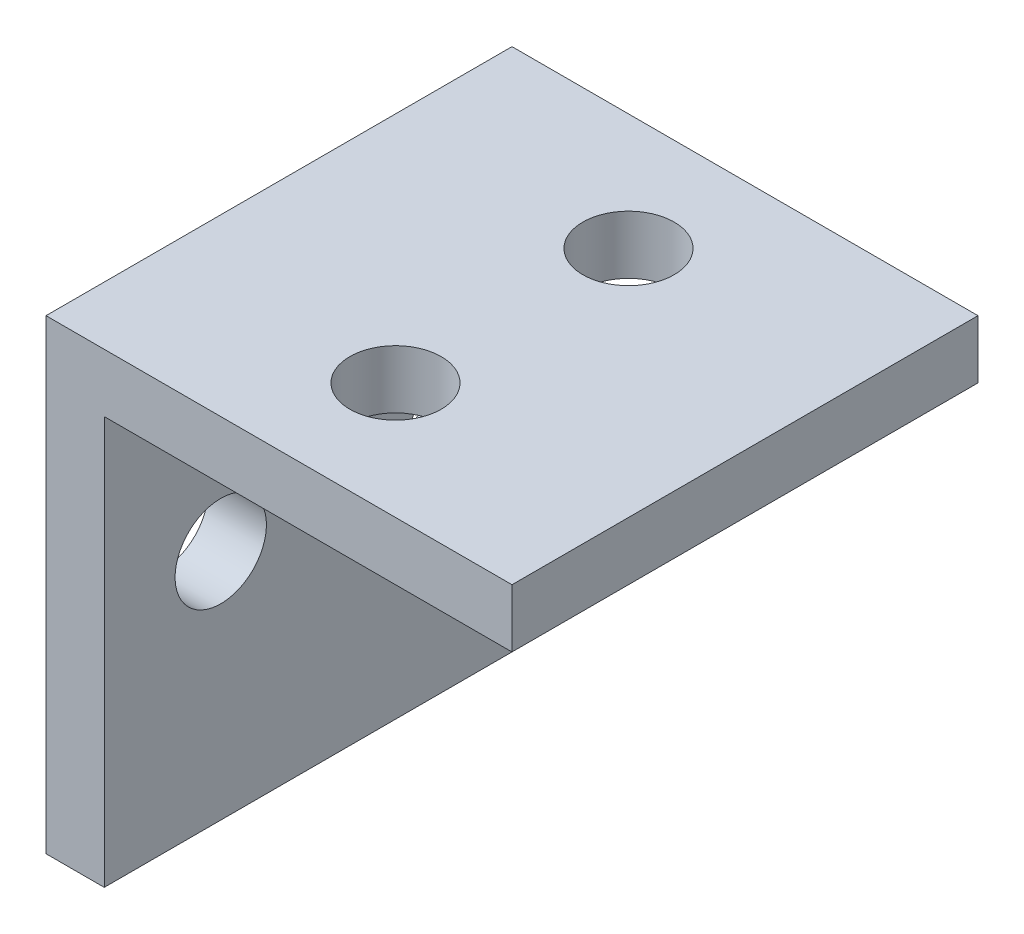
ISO-10303-21;
HEADER;
FILE_DESCRIPTION(('STEP AP214'),'2;1');
FILE_NAME('part.step','',(''),(''),'','','');
FILE_SCHEMA(('AUTOMOTIVE_DESIGN { 1 0 10303 214 1 1 1 1 }'));
ENDSEC;
DATA;
#1=APPLICATION_CONTEXT('core data for automotive mechanical design processes');
#2=APPLICATION_PROTOCOL_DEFINITION('international standard','automotive_design',2000,#1);
#3=PRODUCT_CONTEXT('',#1,'mechanical');
#4=PRODUCT('Part','Part','',(#3));
#5=PRODUCT_RELATED_PRODUCT_CATEGORY('part','',(#4));
#6=PRODUCT_DEFINITION_FORMATION('','',#4);
#7=PRODUCT_DEFINITION_CONTEXT('part definition',#1,'design');
#8=PRODUCT_DEFINITION('design','',#6,#7);
#9=PRODUCT_DEFINITION_SHAPE('','',#8);
#10=(LENGTH_UNIT() NAMED_UNIT(*) SI_UNIT(.MILLI.,.METRE.));
#11=(NAMED_UNIT(*) PLANE_ANGLE_UNIT() SI_UNIT($,.RADIAN.));
#12=(NAMED_UNIT(*) SI_UNIT($,.STERADIAN.) SOLID_ANGLE_UNIT());
#13=UNCERTAINTY_MEASURE_WITH_UNIT(LENGTH_MEASURE(1.E-05),#10,'distance_accuracy_value','');
#14=(GEOMETRIC_REPRESENTATION_CONTEXT(3) GLOBAL_UNCERTAINTY_ASSIGNED_CONTEXT((#13)) GLOBAL_UNIT_ASSIGNED_CONTEXT((#10,
#11,#12)) REPRESENTATION_CONTEXT('',''));
#15=CARTESIAN_POINT('',(0.,0.,0.));
#16=DIRECTION('',(0.,0.,1.));
#17=DIRECTION('',(1.,0.,0.));
#18=AXIS2_PLACEMENT_3D('',#15,#16,#17);
#19=CARTESIAN_POINT('',(25.4,0.,25.4));
#20=DIRECTION('',(0.,-1.,0.));
#21=DIRECTION('',(1.,0.,0.));
#22=AXIS2_PLACEMENT_3D('',#19,#20,#21);
#23=PLANE('',#22);
#24=CARTESIAN_POINT('',(12.7,0.,6.35));
#25=DIRECTION('',(0.,-1.,0.));
#26=DIRECTION('',(1.,0.,0.));
#27=AXIS2_PLACEMENT_3D('',#24,#25,#26);
#28=CIRCLE('',#27,2.4892);
#29=CARTESIAN_POINT('',(15.1892,0.,6.35));
#30=VERTEX_POINT('',#29);
#31=EDGE_CURVE('E166',#30,#30,#28,.T.);
#32=ORIENTED_EDGE('',*,*,#31,.T.);
#33=EDGE_LOOP('',(#32));
#34=FACE_BOUND('',#33,.T.);
#35=CARTESIAN_POINT('',(12.7,0.,19.05));
#36=DIRECTION('',(0.,-1.,0.));
#37=DIRECTION('',(1.,0.,0.));
#38=AXIS2_PLACEMENT_3D('',#35,#36,#37);
#39=CIRCLE('',#38,2.4892);
#40=CARTESIAN_POINT('',(15.1892,0.,19.05));
#41=VERTEX_POINT('',#40);
#42=EDGE_CURVE('E169',#41,#41,#39,.T.);
#43=ORIENTED_EDGE('',*,*,#42,.T.);
#44=EDGE_LOOP('',(#43));
#45=FACE_BOUND('',#44,.T.);
#46=DIRECTION('',(-1.,0.,0.));
#47=VECTOR('',#46,1.);
#48=CARTESIAN_POINT('',(25.4,0.,0.));
#49=LINE('',#48,#47);
#50=CARTESIAN_POINT('',(25.4,0.,0.));
#51=VERTEX_POINT('',#50);
#52=CARTESIAN_POINT('',(0.,0.,0.));
#53=VERTEX_POINT('',#52);
#54=EDGE_CURVE('E121',#51,#53,#49,.T.);
#55=ORIENTED_EDGE('',*,*,#54,.T.);
#56=DIRECTION('',(0.,0.,-1.));
#57=VECTOR('',#56,1.);
#58=CARTESIAN_POINT('',(0.,0.,25.4));
#59=LINE('',#58,#57);
#60=CARTESIAN_POINT('',(0.,0.,25.4));
#61=VERTEX_POINT('',#60);
#62=EDGE_CURVE('E11',#61,#53,#59,.T.);
#63=ORIENTED_EDGE('',*,*,#62,.F.);
#64=DIRECTION('',(-1.,0.,0.));
#65=VECTOR('',#64,1.);
#66=CARTESIAN_POINT('',(25.4,0.,25.4));
#67=LINE('',#66,#65);
#68=CARTESIAN_POINT('',(25.4,0.,25.4));
#69=VERTEX_POINT('',#68);
#70=EDGE_CURVE('E132',#69,#61,#67,.T.);
#71=ORIENTED_EDGE('',*,*,#70,.F.);
#72=DIRECTION('',(0.,0.,-1.));
#73=VECTOR('',#72,1.);
#74=CARTESIAN_POINT('',(25.4,0.,25.4));
#75=LINE('',#74,#73);
#76=EDGE_CURVE('E117',#69,#51,#75,.T.);
#77=ORIENTED_EDGE('',*,*,#76,.T.);
#78=EDGE_LOOP('',(#55,#63,#71,#77));
#79=FACE_BOUND('',#78,.T.);
#80=ADVANCED_FACE('F37',(#34,#45,#79),#23,.F.);
#81=CARTESIAN_POINT('',(0.,0.,25.4));
#82=DIRECTION('',(1.,0.,0.));
#83=DIRECTION('',(0.,1.,0.));
#84=AXIS2_PLACEMENT_3D('',#81,#82,#83);
#85=PLANE('',#84);
#86=CARTESIAN_POINT('',(0.,-12.7,6.35));
#87=DIRECTION('',(1.,0.,0.));
#88=DIRECTION('',(0.,1.,0.));
#89=AXIS2_PLACEMENT_3D('',#86,#87,#88);
#90=CIRCLE('',#89,2.4892);
#91=CARTESIAN_POINT('',(0.,-10.2108,6.35));
#92=VERTEX_POINT('',#91);
#93=EDGE_CURVE('E125',#92,#92,#90,.T.);
#94=ORIENTED_EDGE('',*,*,#93,.T.);
#95=EDGE_LOOP('',(#94));
#96=FACE_BOUND('',#95,.T.);
#97=CARTESIAN_POINT('',(0.,-12.7,19.05));
#98=DIRECTION('',(1.,0.,0.));
#99=DIRECTION('',(0.,1.,0.));
#100=AXIS2_PLACEMENT_3D('',#97,#98,#99);
#101=CIRCLE('',#100,2.4892);
#102=CARTESIAN_POINT('',(0.,-10.2108,19.05));
#103=VERTEX_POINT('',#102);
#104=EDGE_CURVE('E186',#103,#103,#101,.T.);
#105=ORIENTED_EDGE('',*,*,#104,.T.);
#106=EDGE_LOOP('',(#105));
#107=FACE_BOUND('',#106,.T.);
#108=DIRECTION('',(0.,-1.,0.));
#109=VECTOR('',#108,1.);
#110=CARTESIAN_POINT('',(0.,0.,0.));
#111=LINE('',#110,#109);
#112=CARTESIAN_POINT('',(0.,-25.4,0.));
#113=VERTEX_POINT('',#112);
#114=EDGE_CURVE('E124',#53,#113,#111,.T.);
#115=ORIENTED_EDGE('',*,*,#114,.T.);
#116=DIRECTION('',(0.,0.,-1.));
#117=VECTOR('',#116,1.);
#118=CARTESIAN_POINT('',(0.,-25.4,25.4));
#119=LINE('',#118,#117);
#120=CARTESIAN_POINT('',(0.,-25.4,25.4));
#121=VERTEX_POINT('',#120);
#122=EDGE_CURVE('E45',#121,#113,#119,.T.);
#123=ORIENTED_EDGE('',*,*,#122,.F.);
#124=DIRECTION('',(0.,-1.,0.));
#125=VECTOR('',#124,1.);
#126=CARTESIAN_POINT('',(0.,0.,25.4));
#127=LINE('',#126,#125);
#128=EDGE_CURVE('E90',#61,#121,#127,.T.);
#129=ORIENTED_EDGE('',*,*,#128,.F.);
#130=ORIENTED_EDGE('',*,*,#62,.T.);
#131=EDGE_LOOP('',(#115,#123,#129,#130));
#132=FACE_BOUND('',#131,.T.);
#133=ADVANCED_FACE('F157',(#96,#107,#132),#85,.F.);
#134=CARTESIAN_POINT('',(0.,-25.4,25.4));
#135=DIRECTION('',(0.,1.,0.));
#136=DIRECTION('',(0.,0.,1.));
#137=AXIS2_PLACEMENT_3D('',#134,#135,#136);
#138=PLANE('',#137);
#139=DIRECTION('',(1.,0.,0.));
#140=VECTOR('',#139,1.);
#141=CARTESIAN_POINT('',(0.,-25.4,0.));
#142=LINE('',#141,#140);
#143=CARTESIAN_POINT('',(3.175,-25.4,0.));
#144=VERTEX_POINT('',#143);
#145=EDGE_CURVE('E127',#113,#144,#142,.T.);
#146=ORIENTED_EDGE('',*,*,#145,.T.);
#147=DIRECTION('',(0.,0.,-1.));
#148=VECTOR('',#147,1.);
#149=CARTESIAN_POINT('',(3.175,-25.4,25.4));
#150=LINE('',#149,#148);
#151=CARTESIAN_POINT('',(3.175,-25.4,25.4));
#152=VERTEX_POINT('',#151);
#153=EDGE_CURVE('E112',#152,#144,#150,.T.);
#154=ORIENTED_EDGE('',*,*,#153,.F.);
#155=DIRECTION('',(1.,0.,0.));
#156=VECTOR('',#155,1.);
#157=CARTESIAN_POINT('',(0.,-25.4,25.4));
#158=LINE('',#157,#156);
#159=EDGE_CURVE('E103',#121,#152,#158,.T.);
#160=ORIENTED_EDGE('',*,*,#159,.F.);
#161=ORIENTED_EDGE('',*,*,#122,.T.);
#162=EDGE_LOOP('',(#146,#154,#160,#161));
#163=FACE_BOUND('',#162,.T.);
#164=ADVANCED_FACE('F138',(#163),#138,.F.);
#165=CARTESIAN_POINT('',(3.175,-25.4,25.4));
#166=DIRECTION('',(-1.,0.,0.));
#167=DIRECTION('',(0.,-1.,0.));
#168=AXIS2_PLACEMENT_3D('',#165,#166,#167);
#169=PLANE('',#168);
#170=CARTESIAN_POINT('',(3.175,-12.7,6.35));
#171=DIRECTION('',(1.,0.,0.));
#172=DIRECTION('',(0.,1.,0.));
#173=AXIS2_PLACEMENT_3D('',#170,#171,#172);
#174=CIRCLE('',#173,2.4892);
#175=CARTESIAN_POINT('',(3.175,-10.2108,6.35));
#176=VERTEX_POINT('',#175);
#177=EDGE_CURVE('E180',#176,#176,#174,.T.);
#178=ORIENTED_EDGE('',*,*,#177,.F.);
#179=EDGE_LOOP('',(#178));
#180=FACE_BOUND('',#179,.T.);
#181=CARTESIAN_POINT('',(3.175,-12.7,19.05));
#182=DIRECTION('',(1.,0.,0.));
#183=DIRECTION('',(0.,1.,0.));
#184=AXIS2_PLACEMENT_3D('',#181,#182,#183);
#185=CIRCLE('',#184,2.4892);
#186=CARTESIAN_POINT('',(3.175,-10.2108,19.05));
#187=VERTEX_POINT('',#186);
#188=EDGE_CURVE('E183',#187,#187,#185,.T.);
#189=ORIENTED_EDGE('',*,*,#188,.F.);
#190=EDGE_LOOP('',(#189));
#191=FACE_BOUND('',#190,.T.);
#192=DIRECTION('',(0.,1.,0.));
#193=VECTOR('',#192,1.);
#194=CARTESIAN_POINT('',(3.175,-25.4,0.));
#195=LINE('',#194,#193);
#196=CARTESIAN_POINT('',(3.175,-3.175,0.));
#197=VERTEX_POINT('',#196);
#198=EDGE_CURVE('E111',#144,#197,#195,.T.);
#199=ORIENTED_EDGE('',*,*,#198,.T.);
#200=DIRECTION('',(0.,0.,-1.));
#201=VECTOR('',#200,1.);
#202=CARTESIAN_POINT('',(3.175,-3.175,25.4));
#203=LINE('',#202,#201);
#204=CARTESIAN_POINT('',(3.175,-3.175,25.4));
#205=VERTEX_POINT('',#204);
#206=EDGE_CURVE('E108',#205,#197,#203,.T.);
#207=ORIENTED_EDGE('',*,*,#206,.F.);
#208=DIRECTION('',(0.,1.,0.));
#209=VECTOR('',#208,1.);
#210=CARTESIAN_POINT('',(3.175,-25.4,25.4));
#211=LINE('',#210,#209);
#212=EDGE_CURVE('E97',#152,#205,#211,.T.);
#213=ORIENTED_EDGE('',*,*,#212,.F.);
#214=ORIENTED_EDGE('',*,*,#153,.T.);
#215=EDGE_LOOP('',(#199,#207,#213,#214));
#216=FACE_BOUND('',#215,.T.);
#217=ADVANCED_FACE('F109',(#180,#191,#216),#169,.F.);
#218=CARTESIAN_POINT('',(3.175,-3.175,25.4));
#219=DIRECTION('',(0.,1.,0.));
#220=DIRECTION('',(-1.,0.,0.));
#221=AXIS2_PLACEMENT_3D('',#218,#219,#220);
#222=PLANE('',#221);
#223=CARTESIAN_POINT('',(12.7,-3.175,6.35));
#224=DIRECTION('',(0.,-1.,0.));
#225=DIRECTION('',(1.,0.,0.));
#226=AXIS2_PLACEMENT_3D('',#223,#224,#225);
#227=CIRCLE('',#226,2.4892);
#228=CARTESIAN_POINT('',(15.1892,-3.175,6.35));
#229=VERTEX_POINT('',#228);
#230=EDGE_CURVE('E174',#229,#229,#227,.T.);
#231=ORIENTED_EDGE('',*,*,#230,.F.);
#232=EDGE_LOOP('',(#231));
#233=FACE_BOUND('',#232,.T.);
#234=CARTESIAN_POINT('',(12.7,-3.175,19.05));
#235=DIRECTION('',(0.,-1.,0.));
#236=DIRECTION('',(1.,0.,0.));
#237=AXIS2_PLACEMENT_3D('',#234,#235,#236);
#238=CIRCLE('',#237,2.4892);
#239=CARTESIAN_POINT('',(15.1892,-3.175,19.05));
#240=VERTEX_POINT('',#239);
#241=EDGE_CURVE('E171',#240,#240,#238,.T.);
#242=ORIENTED_EDGE('',*,*,#241,.F.);
#243=EDGE_LOOP('',(#242));
#244=FACE_BOUND('',#243,.T.);
#245=DIRECTION('',(1.,0.,0.));
#246=VECTOR('',#245,1.);
#247=CARTESIAN_POINT('',(3.175,-3.175,0.));
#248=LINE('',#247,#246);
#249=CARTESIAN_POINT('',(25.4,-3.175,0.));
#250=VERTEX_POINT('',#249);
#251=EDGE_CURVE('E76',#197,#250,#248,.T.);
#252=ORIENTED_EDGE('',*,*,#251,.T.);
#253=DIRECTION('',(0.,0.,-1.));
#254=VECTOR('',#253,1.);
#255=CARTESIAN_POINT('',(25.4,-3.175,25.4));
#256=LINE('',#255,#254);
#257=CARTESIAN_POINT('',(25.4,-3.175,25.4));
#258=VERTEX_POINT('',#257);
#259=EDGE_CURVE('E113',#258,#250,#256,.T.);
#260=ORIENTED_EDGE('',*,*,#259,.F.);
#261=DIRECTION('',(1.,0.,0.));
#262=VECTOR('',#261,1.);
#263=CARTESIAN_POINT('',(3.175,-3.175,25.4));
#264=LINE('',#263,#262);
#265=EDGE_CURVE('E101',#205,#258,#264,.T.);
#266=ORIENTED_EDGE('',*,*,#265,.F.);
#267=ORIENTED_EDGE('',*,*,#206,.T.);
#268=EDGE_LOOP('',(#252,#260,#266,#267));
#269=FACE_BOUND('',#268,.T.);
#270=ADVANCED_FACE('F115',(#233,#244,#269),#222,.F.);
#271=CARTESIAN_POINT('',(25.4,-3.175,25.4));
#272=DIRECTION('',(-1.,0.,0.));
#273=DIRECTION('',(0.,0.,1.));
#274=AXIS2_PLACEMENT_3D('',#271,#272,#273);
#275=PLANE('',#274);
#276=DIRECTION('',(0.,1.,0.));
#277=VECTOR('',#276,1.);
#278=CARTESIAN_POINT('',(25.4,-3.175,0.));
#279=LINE('',#278,#277);
#280=EDGE_CURVE('E82',#250,#51,#279,.T.);
#281=ORIENTED_EDGE('',*,*,#280,.T.);
#282=ORIENTED_EDGE('',*,*,#76,.F.);
#283=DIRECTION('',(0.,1.,0.));
#284=VECTOR('',#283,1.);
#285=CARTESIAN_POINT('',(25.4,-3.175,25.4));
#286=LINE('',#285,#284);
#287=EDGE_CURVE('E53',#258,#69,#286,.T.);
#288=ORIENTED_EDGE('',*,*,#287,.F.);
#289=ORIENTED_EDGE('',*,*,#259,.T.);
#290=EDGE_LOOP('',(#281,#282,#288,#289));
#291=FACE_BOUND('',#290,.T.);
#292=ADVANCED_FACE('F145',(#291),#275,.F.);
#293=CARTESIAN_POINT('',(0.,0.,25.4));
#294=DIRECTION('',(0.,0.,1.));
#295=DIRECTION('',(1.,0.,0.));
#296=AXIS2_PLACEMENT_3D('',#293,#294,#295);
#297=PLANE('',#296);
#298=ORIENTED_EDGE('',*,*,#70,.T.);
#299=ORIENTED_EDGE('',*,*,#128,.T.);
#300=ORIENTED_EDGE('',*,*,#159,.T.);
#301=ORIENTED_EDGE('',*,*,#212,.T.);
#302=ORIENTED_EDGE('',*,*,#265,.T.);
#303=ORIENTED_EDGE('',*,*,#287,.T.);
#304=EDGE_LOOP('',(#298,#299,#300,#301,#302,#303));
#305=FACE_BOUND('',#304,.T.);
#306=ADVANCED_FACE('F99',(#305),#297,.T.);
#307=CARTESIAN_POINT('',(0.,0.,0.));
#308=DIRECTION('',(0.,0.,1.));
#309=DIRECTION('',(1.,0.,0.));
#310=AXIS2_PLACEMENT_3D('',#307,#308,#309);
#311=PLANE('',#310);
#312=ORIENTED_EDGE('',*,*,#54,.F.);
#313=ORIENTED_EDGE('',*,*,#280,.F.);
#314=ORIENTED_EDGE('',*,*,#251,.F.);
#315=ORIENTED_EDGE('',*,*,#198,.F.);
#316=ORIENTED_EDGE('',*,*,#145,.F.);
#317=ORIENTED_EDGE('',*,*,#114,.F.);
#318=EDGE_LOOP('',(#312,#313,#314,#315,#316,#317));
#319=FACE_BOUND('',#318,.T.);
#320=ADVANCED_FACE('F141',(#319),#311,.F.);
#321=CARTESIAN_POINT('',(0.,-12.7,19.05));
#322=DIRECTION('',(1.,0.,0.));
#323=DIRECTION('',(0.,1.,0.));
#324=AXIS2_PLACEMENT_3D('',#321,#322,#323);
#325=CYLINDRICAL_SURFACE('',#324,2.4892);
#326=ORIENTED_EDGE('',*,*,#104,.F.);
#327=EDGE_LOOP('',(#326));
#328=FACE_BOUND('',#327,.T.);
#329=ORIENTED_EDGE('',*,*,#188,.T.);
#330=EDGE_LOOP('',(#329));
#331=FACE_BOUND('',#330,.T.);
#332=ADVANCED_FACE('F210',(#328,#331),#325,.F.);
#333=CARTESIAN_POINT('',(0.,-12.7,6.35));
#334=DIRECTION('',(1.,0.,0.));
#335=DIRECTION('',(0.,1.,0.));
#336=AXIS2_PLACEMENT_3D('',#333,#334,#335);
#337=CYLINDRICAL_SURFACE('',#336,2.4892);
#338=ORIENTED_EDGE('',*,*,#93,.F.);
#339=EDGE_LOOP('',(#338));
#340=FACE_BOUND('',#339,.T.);
#341=ORIENTED_EDGE('',*,*,#177,.T.);
#342=EDGE_LOOP('',(#341));
#343=FACE_BOUND('',#342,.T.);
#344=ADVANCED_FACE('F202',(#340,#343),#337,.F.);
#345=CARTESIAN_POINT('',(12.7,0.,19.05));
#346=DIRECTION('',(0.,-1.,0.));
#347=DIRECTION('',(1.,0.,0.));
#348=AXIS2_PLACEMENT_3D('',#345,#346,#347);
#349=CYLINDRICAL_SURFACE('',#348,2.4892);
#350=ORIENTED_EDGE('',*,*,#42,.F.);
#351=EDGE_LOOP('',(#350));
#352=FACE_BOUND('',#351,.T.);
#353=ORIENTED_EDGE('',*,*,#241,.T.);
#354=EDGE_LOOP('',(#353));
#355=FACE_BOUND('',#354,.T.);
#356=ADVANCED_FACE('F200',(#352,#355),#349,.F.);
#357=CARTESIAN_POINT('',(12.7,0.,6.35));
#358=DIRECTION('',(0.,-1.,0.));
#359=DIRECTION('',(1.,0.,0.));
#360=AXIS2_PLACEMENT_3D('',#357,#358,#359);
#361=CYLINDRICAL_SURFACE('',#360,2.4892);
#362=ORIENTED_EDGE('',*,*,#31,.F.);
#363=EDGE_LOOP('',(#362));
#364=FACE_BOUND('',#363,.T.);
#365=ORIENTED_EDGE('',*,*,#230,.T.);
#366=EDGE_LOOP('',(#365));
#367=FACE_BOUND('',#366,.T.);
#368=ADVANCED_FACE('F196',(#364,#367),#361,.F.);
#369=CLOSED_SHELL('',(#80,#133,#164,#217,#270,#292,#306,#320,#332,#344,#356,#368));
#370=MANIFOLD_SOLID_BREP('B2',#369);
#371=ADVANCED_BREP_SHAPE_REPRESENTATION('',(#18,#370),#14);
#372=SHAPE_DEFINITION_REPRESENTATION(#9,#371);
ENDSEC;
END-ISO-10303-21;
